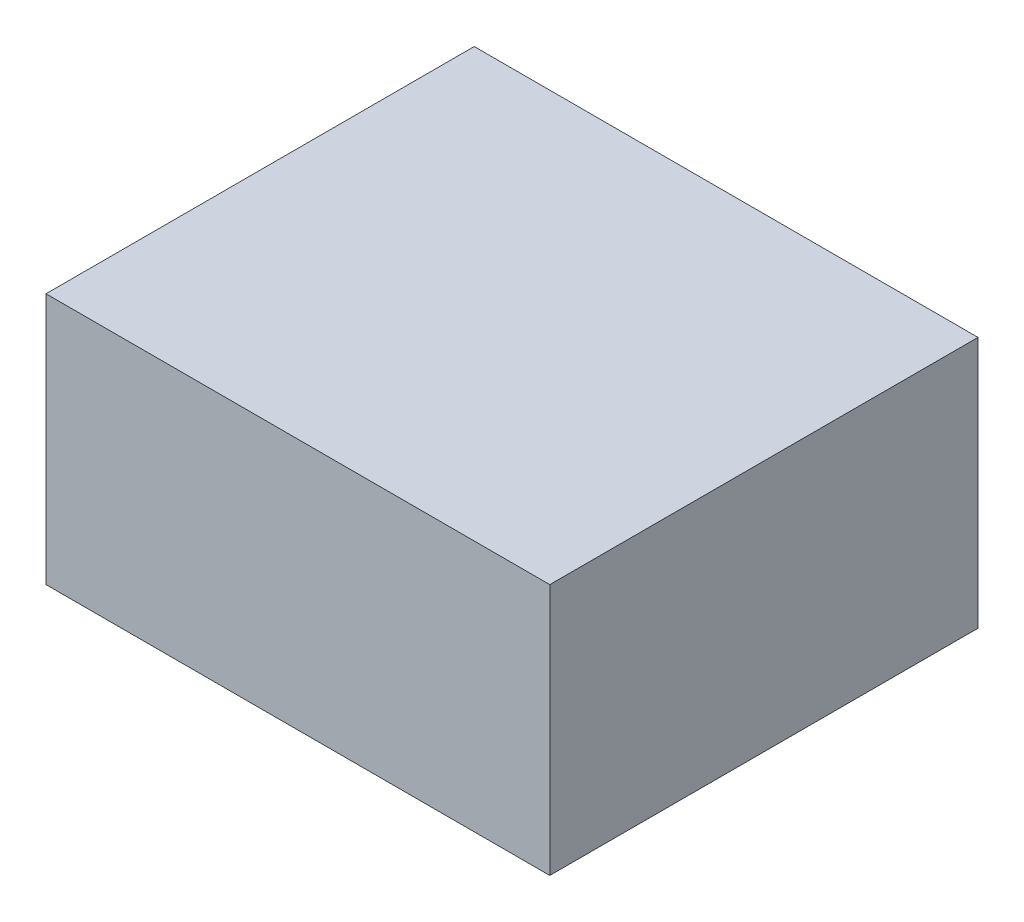
ISO-10303-21;
HEADER;
FILE_DESCRIPTION(('STEP AP214'),'2;1');
FILE_NAME('part.step','',(''),(''),'','','');
FILE_SCHEMA(('AUTOMOTIVE_DESIGN { 1 0 10303 214 1 1 1 1 }'));
ENDSEC;
DATA;
#1=APPLICATION_CONTEXT('core data for automotive mechanical design processes');
#2=APPLICATION_PROTOCOL_DEFINITION('international standard','automotive_design',2000,#1);
#3=PRODUCT_CONTEXT('',#1,'mechanical');
#4=PRODUCT('Part','Part','',(#3));
#5=PRODUCT_RELATED_PRODUCT_CATEGORY('part','',(#4));
#6=PRODUCT_DEFINITION_FORMATION('','',#4);
#7=PRODUCT_DEFINITION_CONTEXT('part definition',#1,'design');
#8=PRODUCT_DEFINITION('design','',#6,#7);
#9=PRODUCT_DEFINITION_SHAPE('','',#8);
#10=(LENGTH_UNIT() NAMED_UNIT(*) SI_UNIT(.MILLI.,.METRE.));
#11=(NAMED_UNIT(*) PLANE_ANGLE_UNIT() SI_UNIT($,.RADIAN.));
#12=(NAMED_UNIT(*) SI_UNIT($,.STERADIAN.) SOLID_ANGLE_UNIT());
#13=UNCERTAINTY_MEASURE_WITH_UNIT(LENGTH_MEASURE(1.E-05),#10,'distance_accuracy_value','');
#14=(GEOMETRIC_REPRESENTATION_CONTEXT(3) GLOBAL_UNCERTAINTY_ASSIGNED_CONTEXT((#13)) GLOBAL_UNIT_ASSIGNED_CONTEXT((#10,
#11,#12)) REPRESENTATION_CONTEXT('',''));
#15=CARTESIAN_POINT('',(0.,0.,0.));
#16=DIRECTION('',(0.,0.,1.));
#17=DIRECTION('',(1.,0.,0.));
#18=AXIS2_PLACEMENT_3D('',#15,#16,#17);
#19=CARTESIAN_POINT('',(0.,0.,-12.));
#20=DIRECTION('',(-1.,0.,0.));
#21=DIRECTION('',(0.,0.,1.));
#22=AXIS2_PLACEMENT_3D('',#19,#20,#21);
#23=PLANE('',#22);
#24=DIRECTION('',(0.,0.,1.));
#25=VECTOR('',#24,1.);
#26=CARTESIAN_POINT('',(0.,0.,-12.));
#27=LINE('',#26,#25);
#28=CARTESIAN_POINT('',(0.,0.,-12.));
#29=VERTEX_POINT('',#28);
#30=CARTESIAN_POINT('',(0.,0.,5.));
#31=VERTEX_POINT('',#30);
#32=EDGE_CURVE('E38',#29,#31,#27,.T.);
#33=ORIENTED_EDGE('',*,*,#32,.T.);
#34=DIRECTION('',(0.,-1.,0.));
#35=VECTOR('',#34,1.);
#36=CARTESIAN_POINT('',(0.,0.,5.));
#37=LINE('',#36,#35);
#38=CARTESIAN_POINT('',(0.,10.,5.));
#39=VERTEX_POINT('',#38);
#40=EDGE_CURVE('E75',#39,#31,#37,.T.);
#41=ORIENTED_EDGE('',*,*,#40,.F.);
#42=DIRECTION('',(0.,0.,1.));
#43=VECTOR('',#42,1.);
#44=CARTESIAN_POINT('',(0.,10.,-12.));
#45=LINE('',#44,#43);
#46=CARTESIAN_POINT('',(0.,10.,-12.));
#47=VERTEX_POINT('',#46);
#48=EDGE_CURVE('E11',#47,#39,#45,.T.);
#49=ORIENTED_EDGE('',*,*,#48,.F.);
#50=DIRECTION('',(0.,-1.,0.));
#51=VECTOR('',#50,1.);
#52=CARTESIAN_POINT('',(0.,0.,-12.));
#53=LINE('',#52,#51);
#54=EDGE_CURVE('E76',#47,#29,#53,.T.);
#55=ORIENTED_EDGE('',*,*,#54,.T.);
#56=EDGE_LOOP('',(#33,#41,#49,#55));
#57=FACE_BOUND('',#56,.T.);
#58=ADVANCED_FACE('F35',(#57),#23,.T.);
#59=CARTESIAN_POINT('',(0.,10.,-12.));
#60=DIRECTION('',(0.,1.,0.));
#61=DIRECTION('',(0.,0.,1.));
#62=AXIS2_PLACEMENT_3D('',#59,#60,#61);
#63=PLANE('',#62);
#64=ORIENTED_EDGE('',*,*,#48,.T.);
#65=DIRECTION('',(-1.,0.,0.));
#66=VECTOR('',#65,1.);
#67=CARTESIAN_POINT('',(0.,10.,5.));
#68=LINE('',#67,#66);
#69=CARTESIAN_POINT('',(20.,10.,5.));
#70=VERTEX_POINT('',#69);
#71=EDGE_CURVE('E92',#70,#39,#68,.T.);
#72=ORIENTED_EDGE('',*,*,#71,.F.);
#73=DIRECTION('',(0.,0.,1.));
#74=VECTOR('',#73,1.);
#75=CARTESIAN_POINT('',(20.,10.,-12.));
#76=LINE('',#75,#74);
#77=CARTESIAN_POINT('',(20.,10.,-12.));
#78=VERTEX_POINT('',#77);
#79=EDGE_CURVE('E43',#78,#70,#76,.T.);
#80=ORIENTED_EDGE('',*,*,#79,.F.);
#81=DIRECTION('',(-1.,0.,0.));
#82=VECTOR('',#81,1.);
#83=CARTESIAN_POINT('',(0.,10.,-12.));
#84=LINE('',#83,#82);
#85=EDGE_CURVE('E81',#78,#47,#84,.T.);
#86=ORIENTED_EDGE('',*,*,#85,.T.);
#87=EDGE_LOOP('',(#64,#72,#80,#86));
#88=FACE_BOUND('',#87,.T.);
#89=ADVANCED_FACE('F107',(#88),#63,.T.);
#90=CARTESIAN_POINT('',(20.,0.,-12.));
#91=DIRECTION('',(1.,0.,0.));
#92=DIRECTION('',(0.,0.,-1.));
#93=AXIS2_PLACEMENT_3D('',#90,#91,#92);
#94=PLANE('',#93);
#95=ORIENTED_EDGE('',*,*,#79,.T.);
#96=DIRECTION('',(0.,1.,0.));
#97=VECTOR('',#96,1.);
#98=CARTESIAN_POINT('',(20.,0.,5.));
#99=LINE('',#98,#97);
#100=CARTESIAN_POINT('',(20.,0.,5.));
#101=VERTEX_POINT('',#100);
#102=EDGE_CURVE('E88',#101,#70,#99,.T.);
#103=ORIENTED_EDGE('',*,*,#102,.F.);
#104=DIRECTION('',(0.,0.,1.));
#105=VECTOR('',#104,1.);
#106=CARTESIAN_POINT('',(20.,0.,-12.));
#107=LINE('',#106,#105);
#108=CARTESIAN_POINT('',(20.,0.,-12.));
#109=VERTEX_POINT('',#108);
#110=EDGE_CURVE('E80',#109,#101,#107,.T.);
#111=ORIENTED_EDGE('',*,*,#110,.F.);
#112=DIRECTION('',(0.,1.,0.));
#113=VECTOR('',#112,1.);
#114=CARTESIAN_POINT('',(20.,0.,-12.));
#115=LINE('',#114,#113);
#116=EDGE_CURVE('E100',#109,#78,#115,.T.);
#117=ORIENTED_EDGE('',*,*,#116,.T.);
#118=EDGE_LOOP('',(#95,#103,#111,#117));
#119=FACE_BOUND('',#118,.T.);
#120=ADVANCED_FACE('F104',(#119),#94,.T.);
#121=CARTESIAN_POINT('',(0.,0.,-12.));
#122=DIRECTION('',(0.,-1.,0.));
#123=DIRECTION('',(0.,0.,-1.));
#124=AXIS2_PLACEMENT_3D('',#121,#122,#123);
#125=PLANE('',#124);
#126=ORIENTED_EDGE('',*,*,#110,.T.);
#127=DIRECTION('',(1.,0.,0.));
#128=VECTOR('',#127,1.);
#129=CARTESIAN_POINT('',(0.,0.,5.));
#130=LINE('',#129,#128);
#131=EDGE_CURVE('E83',#31,#101,#130,.T.);
#132=ORIENTED_EDGE('',*,*,#131,.F.);
#133=ORIENTED_EDGE('',*,*,#32,.F.);
#134=DIRECTION('',(1.,0.,0.));
#135=VECTOR('',#134,1.);
#136=CARTESIAN_POINT('',(0.,0.,-12.));
#137=LINE('',#136,#135);
#138=EDGE_CURVE('E98',#29,#109,#137,.T.);
#139=ORIENTED_EDGE('',*,*,#138,.T.);
#140=EDGE_LOOP('',(#126,#132,#133,#139));
#141=FACE_BOUND('',#140,.T.);
#142=ADVANCED_FACE('F84',(#141),#125,.T.);
#143=CARTESIAN_POINT('',(0.,0.,-12.));
#144=DIRECTION('',(0.,0.,-1.));
#145=DIRECTION('',(-1.,0.,0.));
#146=AXIS2_PLACEMENT_3D('',#143,#144,#145);
#147=PLANE('',#146);
#148=ORIENTED_EDGE('',*,*,#54,.F.);
#149=ORIENTED_EDGE('',*,*,#85,.F.);
#150=ORIENTED_EDGE('',*,*,#116,.F.);
#151=ORIENTED_EDGE('',*,*,#138,.F.);
#152=EDGE_LOOP('',(#148,#149,#150,#151));
#153=FACE_BOUND('',#152,.T.);
#154=ADVANCED_FACE('F109',(#153),#147,.T.);
#155=CARTESIAN_POINT('',(0.,0.,5.));
#156=DIRECTION('',(0.,0.,-1.));
#157=DIRECTION('',(-1.,0.,0.));
#158=AXIS2_PLACEMENT_3D('',#155,#156,#157);
#159=PLANE('',#158);
#160=ORIENTED_EDGE('',*,*,#40,.T.);
#161=ORIENTED_EDGE('',*,*,#131,.T.);
#162=ORIENTED_EDGE('',*,*,#102,.T.);
#163=ORIENTED_EDGE('',*,*,#71,.T.);
#164=EDGE_LOOP('',(#160,#161,#162,#163));
#165=FACE_BOUND('',#164,.T.);
#166=ADVANCED_FACE('F91',(#165),#159,.F.);
#167=CLOSED_SHELL('',(#58,#89,#120,#142,#154,#166));
#168=MANIFOLD_SOLID_BREP('B2',#167);
#169=ADVANCED_BREP_SHAPE_REPRESENTATION('',(#18,#168),#14);
#170=SHAPE_DEFINITION_REPRESENTATION(#9,#169);
ENDSEC;
END-ISO-10303-21;
